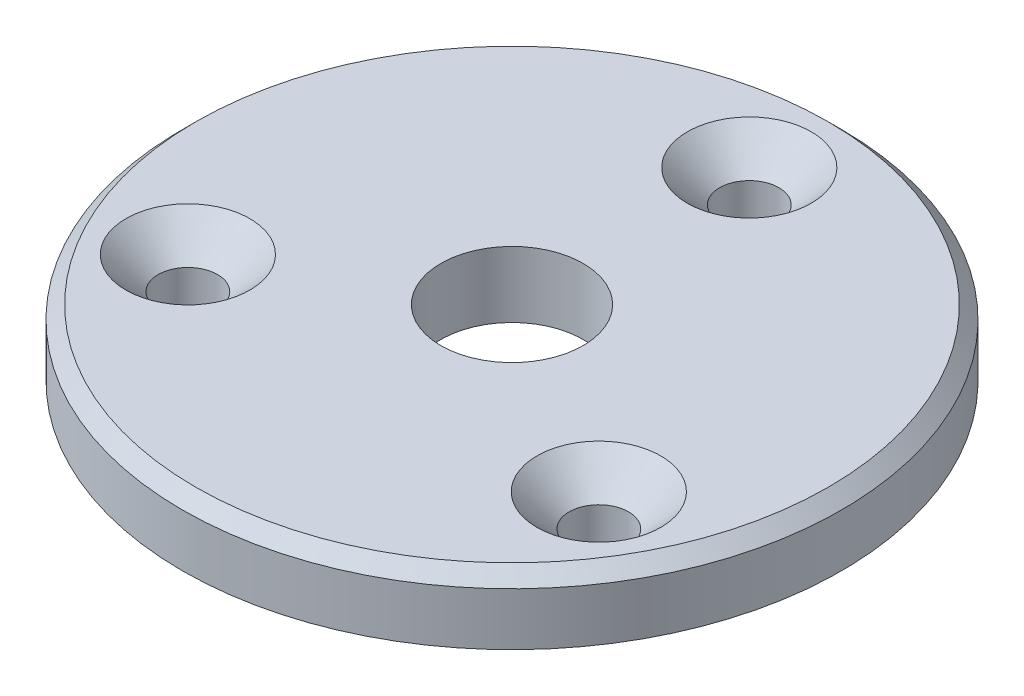
ISO-10303-21;
HEADER;
FILE_DESCRIPTION(('STEP AP214'),'2;1');
FILE_NAME('part.step','',(''),(''),'','','');
FILE_SCHEMA(('AUTOMOTIVE_DESIGN { 1 0 10303 214 1 1 1 1 }'));
ENDSEC;
DATA;
#1=APPLICATION_CONTEXT('core data for automotive mechanical design processes');
#2=APPLICATION_PROTOCOL_DEFINITION('international standard','automotive_design',2000,#1);
#3=PRODUCT_CONTEXT('',#1,'mechanical');
#4=PRODUCT('Part','Part','',(#3));
#5=PRODUCT_RELATED_PRODUCT_CATEGORY('part','',(#4));
#6=PRODUCT_DEFINITION_FORMATION('','',#4);
#7=PRODUCT_DEFINITION_CONTEXT('part definition',#1,'design');
#8=PRODUCT_DEFINITION('design','',#6,#7);
#9=PRODUCT_DEFINITION_SHAPE('','',#8);
#10=(LENGTH_UNIT() NAMED_UNIT(*) SI_UNIT(.MILLI.,.METRE.));
#11=(NAMED_UNIT(*) PLANE_ANGLE_UNIT() SI_UNIT($,.RADIAN.));
#12=(NAMED_UNIT(*) SI_UNIT($,.STERADIAN.) SOLID_ANGLE_UNIT());
#13=UNCERTAINTY_MEASURE_WITH_UNIT(LENGTH_MEASURE(1.E-05),#10,'distance_accuracy_value','');
#14=(GEOMETRIC_REPRESENTATION_CONTEXT(3) GLOBAL_UNCERTAINTY_ASSIGNED_CONTEXT((#13)) GLOBAL_UNIT_ASSIGNED_CONTEXT((#10,
#11,#12)) REPRESENTATION_CONTEXT('',''));
#15=CARTESIAN_POINT('',(0.,0.,0.));
#16=DIRECTION('',(0.,0.,1.));
#17=DIRECTION('',(1.,0.,0.));
#18=AXIS2_PLACEMENT_3D('',#15,#16,#17);
#19=CARTESIAN_POINT('',(0.,5.,0.));
#20=DIRECTION('',(0.,-1.,0.));
#21=DIRECTION('',(0.,0.,-1.));
#22=AXIS2_PLACEMENT_3D('',#19,#20,#21);
#23=CYLINDRICAL_SURFACE('',#22,25.);
#24=CARTESIAN_POINT('',(0.,4.,0.));
#25=DIRECTION('',(0.,1.,0.));
#26=DIRECTION('',(0.,0.,1.));
#27=AXIS2_PLACEMENT_3D('',#24,#25,#26);
#28=CIRCLE('',#27,25.);
#29=CARTESIAN_POINT('',(0.,4.,25.));
#30=VERTEX_POINT('',#29);
#31=EDGE_CURVE('E12',#30,#30,#28,.F.);
#32=ORIENTED_EDGE('',*,*,#31,.T.);
#33=EDGE_LOOP('',(#32));
#34=FACE_BOUND('',#33,.T.);
#35=CARTESIAN_POINT('',(0.,0.,0.));
#36=DIRECTION('',(0.,1.,0.));
#37=DIRECTION('',(0.,0.,1.));
#38=AXIS2_PLACEMENT_3D('',#35,#36,#37);
#39=CIRCLE('',#38,25.);
#40=CARTESIAN_POINT('',(0.,0.,25.));
#41=VERTEX_POINT('',#40);
#42=EDGE_CURVE('E62',#41,#41,#39,.T.);
#43=ORIENTED_EDGE('',*,*,#42,.T.);
#44=EDGE_LOOP('',(#43));
#45=FACE_BOUND('',#44,.T.);
#46=ADVANCED_FACE('F51',(#34,#45),#23,.T.);
#47=CARTESIAN_POINT('',(0.,5.,0.));
#48=DIRECTION('',(0.,1.,0.));
#49=DIRECTION('',(0.,0.,1.));
#50=AXIS2_PLACEMENT_3D('',#47,#48,#49);
#51=PLANE('',#50);
#52=CARTESIAN_POINT('',(-15.58845726812,5.,8.99999999999986));
#53=DIRECTION('',(0.,1.,0.));
#54=DIRECTION('',(0.,0.,1.));
#55=AXIS2_PLACEMENT_3D('',#52,#53,#54);
#56=CIRCLE('',#55,4.7);
#57=CARTESIAN_POINT('',(-15.58845726812,5.,13.6999999999999));
#58=VERTEX_POINT('',#57);
#59=EDGE_CURVE('E98',#58,#58,#56,.T.);
#60=ORIENTED_EDGE('',*,*,#59,.F.);
#61=EDGE_LOOP('',(#60));
#62=FACE_BOUND('',#61,.T.);
#63=CARTESIAN_POINT('',(15.5884572681199,5.,9.00000000000008));
#64=DIRECTION('',(0.,1.,0.));
#65=DIRECTION('',(0.,0.,1.));
#66=AXIS2_PLACEMENT_3D('',#63,#64,#65);
#67=CIRCLE('',#66,4.7);
#68=CARTESIAN_POINT('',(15.5884572681199,5.,13.7000000000001));
#69=VERTEX_POINT('',#68);
#70=EDGE_CURVE('E89',#69,#69,#67,.T.);
#71=ORIENTED_EDGE('',*,*,#70,.F.);
#72=EDGE_LOOP('',(#71));
#73=FACE_BOUND('',#72,.T.);
#74=CARTESIAN_POINT('',(0.,5.,0.));
#75=DIRECTION('',(0.,1.,0.));
#76=DIRECTION('',(0.,0.,1.));
#77=AXIS2_PLACEMENT_3D('',#74,#75,#76);
#78=CIRCLE('',#77,5.39999999999999);
#79=CARTESIAN_POINT('',(0.,5.,5.39999999999999));
#80=VERTEX_POINT('',#79);
#81=EDGE_CURVE('E80',#80,#80,#78,.T.);
#82=ORIENTED_EDGE('',*,*,#81,.F.);
#83=EDGE_LOOP('',(#82));
#84=FACE_BOUND('',#83,.T.);
#85=CARTESIAN_POINT('',(0.,5.,-18.));
#86=DIRECTION('',(0.,1.,0.));
#87=DIRECTION('',(0.,0.,1.));
#88=AXIS2_PLACEMENT_3D('',#85,#86,#87);
#89=CIRCLE('',#88,4.7);
#90=CARTESIAN_POINT('',(0.,5.,-13.3));
#91=VERTEX_POINT('',#90);
#92=EDGE_CURVE('E74',#91,#91,#89,.T.);
#93=ORIENTED_EDGE('',*,*,#92,.F.);
#94=EDGE_LOOP('',(#93));
#95=FACE_BOUND('',#94,.T.);
#96=CARTESIAN_POINT('',(0.,5.,0.));
#97=DIRECTION('',(0.,1.,0.));
#98=DIRECTION('',(0.,0.,1.));
#99=AXIS2_PLACEMENT_3D('',#96,#97,#98);
#100=CIRCLE('',#99,24.);
#101=CARTESIAN_POINT('',(0.,5.,24.));
#102=VERTEX_POINT('',#101);
#103=EDGE_CURVE('E58',#102,#102,#100,.T.);
#104=ORIENTED_EDGE('',*,*,#103,.T.);
#105=EDGE_LOOP('',(#104));
#106=FACE_BOUND('',#105,.T.);
#107=ADVANCED_FACE('F104',(#62,#73,#84,#95,#106),#51,.T.);
#108=CARTESIAN_POINT('',(0.,0.,0.));
#109=DIRECTION('',(0.,1.,0.));
#110=DIRECTION('',(0.,0.,1.));
#111=AXIS2_PLACEMENT_3D('',#108,#109,#110);
#112=PLANE('',#111);
#113=CARTESIAN_POINT('',(-15.58845726812,0.,8.99999999999986));
#114=DIRECTION('',(0.,1.,0.));
#115=DIRECTION('',(0.,0.,1.));
#116=AXIS2_PLACEMENT_3D('',#113,#114,#115);
#117=CIRCLE('',#116,2.25);
#118=CARTESIAN_POINT('',(-15.58845726812,0.,11.2499999999999));
#119=VERTEX_POINT('',#118);
#120=EDGE_CURVE('E92',#119,#119,#117,.T.);
#121=ORIENTED_EDGE('',*,*,#120,.T.);
#122=EDGE_LOOP('',(#121));
#123=FACE_BOUND('',#122,.T.);
#124=CARTESIAN_POINT('',(15.5884572681199,0.,9.00000000000008));
#125=DIRECTION('',(0.,1.,0.));
#126=DIRECTION('',(0.,0.,1.));
#127=AXIS2_PLACEMENT_3D('',#124,#125,#126);
#128=CIRCLE('',#127,2.25);
#129=CARTESIAN_POINT('',(15.5884572681199,0.,11.2500000000001));
#130=VERTEX_POINT('',#129);
#131=EDGE_CURVE('E83',#130,#130,#128,.T.);
#132=ORIENTED_EDGE('',*,*,#131,.T.);
#133=EDGE_LOOP('',(#132));
#134=FACE_BOUND('',#133,.T.);
#135=CARTESIAN_POINT('',(0.,0.,0.));
#136=DIRECTION('',(0.,1.,0.));
#137=DIRECTION('',(0.,0.,1.));
#138=AXIS2_PLACEMENT_3D('',#135,#136,#137);
#139=CIRCLE('',#138,5.4);
#140=CARTESIAN_POINT('',(0.,0.,5.4));
#141=VERTEX_POINT('',#140);
#142=EDGE_CURVE('E77',#141,#141,#139,.T.);
#143=ORIENTED_EDGE('',*,*,#142,.T.);
#144=EDGE_LOOP('',(#143));
#145=FACE_BOUND('',#144,.T.);
#146=CARTESIAN_POINT('',(0.,0.,-18.));
#147=DIRECTION('',(0.,1.,0.));
#148=DIRECTION('',(0.,0.,1.));
#149=AXIS2_PLACEMENT_3D('',#146,#147,#148);
#150=CIRCLE('',#149,2.25);
#151=CARTESIAN_POINT('',(0.,0.,-15.75));
#152=VERTEX_POINT('',#151);
#153=EDGE_CURVE('E66',#152,#152,#150,.T.);
#154=ORIENTED_EDGE('',*,*,#153,.T.);
#155=EDGE_LOOP('',(#154));
#156=FACE_BOUND('',#155,.T.);
#157=ORIENTED_EDGE('',*,*,#42,.F.);
#158=EDGE_LOOP('',(#157));
#159=FACE_BOUND('',#158,.T.);
#160=ADVANCED_FACE('F107',(#123,#134,#145,#156,#159),#112,.F.);
#161=CARTESIAN_POINT('',(0.,5.,0.));
#162=DIRECTION('',(0.,-1.,0.));
#163=DIRECTION('',(0.,0.,-1.));
#164=AXIS2_PLACEMENT_3D('',#161,#162,#163);
#165=CONICAL_SURFACE('',#164,24.,0.78539816339744);
#166=ORIENTED_EDGE('',*,*,#31,.F.);
#167=EDGE_LOOP('',(#166));
#168=FACE_BOUND('',#167,.T.);
#169=ORIENTED_EDGE('',*,*,#103,.F.);
#170=EDGE_LOOP('',(#169));
#171=FACE_BOUND('',#170,.T.);
#172=ADVANCED_FACE('F53',(#168,#171),#165,.T.);
#173=CARTESIAN_POINT('',(0.,5.,-18.));
#174=DIRECTION('',(0.,1.,0.));
#175=DIRECTION('',(0.,0.,1.));
#176=AXIS2_PLACEMENT_3D('',#173,#174,#175);
#177=CYLINDRICAL_SURFACE('',#176,2.25);
#178=ORIENTED_EDGE('',*,*,#153,.F.);
#179=EDGE_LOOP('',(#178));
#180=FACE_BOUND('',#179,.T.);
#181=CARTESIAN_POINT('',(0.,2.55,-18.));
#182=DIRECTION('',(0.,1.,0.));
#183=DIRECTION('',(0.,0.,1.));
#184=AXIS2_PLACEMENT_3D('',#181,#182,#183);
#185=CIRCLE('',#184,2.25);
#186=CARTESIAN_POINT('',(0.,2.55,-15.75));
#187=VERTEX_POINT('',#186);
#188=EDGE_CURVE('E71',#187,#187,#185,.T.);
#189=ORIENTED_EDGE('',*,*,#188,.T.);
#190=EDGE_LOOP('',(#189));
#191=FACE_BOUND('',#190,.T.);
#192=ADVANCED_FACE('F118',(#180,#191),#177,.F.);
#193=CARTESIAN_POINT('',(0.,5.,-18.));
#194=DIRECTION('',(0.,1.,0.));
#195=DIRECTION('',(0.,0.,1.));
#196=AXIS2_PLACEMENT_3D('',#193,#194,#195);
#197=CONICAL_SURFACE('',#196,4.7,0.785398163397448);
#198=ORIENTED_EDGE('',*,*,#188,.F.);
#199=EDGE_LOOP('',(#198));
#200=FACE_BOUND('',#199,.T.);
#201=ORIENTED_EDGE('',*,*,#92,.T.);
#202=EDGE_LOOP('',(#201));
#203=FACE_BOUND('',#202,.T.);
#204=ADVANCED_FACE('F115',(#200,#203),#197,.F.);
#205=CARTESIAN_POINT('',(0.,5.,0.));
#206=DIRECTION('',(0.,1.,0.));
#207=DIRECTION('',(0.,0.,1.));
#208=AXIS2_PLACEMENT_3D('',#205,#206,#207);
#209=CYLINDRICAL_SURFACE('',#208,5.39999999999999);
#210=ORIENTED_EDGE('',*,*,#142,.F.);
#211=EDGE_LOOP('',(#210));
#212=FACE_BOUND('',#211,.T.);
#213=ORIENTED_EDGE('',*,*,#81,.T.);
#214=EDGE_LOOP('',(#213));
#215=FACE_BOUND('',#214,.T.);
#216=ADVANCED_FACE('F117',(#212,#215),#209,.F.);
#217=CARTESIAN_POINT('',(15.5884572681199,5.,9.00000000000008));
#218=DIRECTION('',(0.,1.,0.));
#219=DIRECTION('',(0.,0.,1.));
#220=AXIS2_PLACEMENT_3D('',#217,#218,#219);
#221=CYLINDRICAL_SURFACE('',#220,2.25);
#222=ORIENTED_EDGE('',*,*,#131,.F.);
#223=EDGE_LOOP('',(#222));
#224=FACE_BOUND('',#223,.T.);
#225=CARTESIAN_POINT('',(15.5884572681199,2.55,9.00000000000008));
#226=DIRECTION('',(0.,1.,0.));
#227=DIRECTION('',(0.,0.,1.));
#228=AXIS2_PLACEMENT_3D('',#225,#226,#227);
#229=CIRCLE('',#228,2.25);
#230=CARTESIAN_POINT('',(15.5884572681199,2.55,11.2500000000001));
#231=VERTEX_POINT('',#230);
#232=EDGE_CURVE('E86',#231,#231,#229,.T.);
#233=ORIENTED_EDGE('',*,*,#232,.T.);
#234=EDGE_LOOP('',(#233));
#235=FACE_BOUND('',#234,.T.);
#236=ADVANCED_FACE('F125',(#224,#235),#221,.F.);
#237=CARTESIAN_POINT('',(15.5884572681199,5.,9.00000000000008));
#238=DIRECTION('',(0.,1.,0.));
#239=DIRECTION('',(0.,0.,1.));
#240=AXIS2_PLACEMENT_3D('',#237,#238,#239);
#241=CONICAL_SURFACE('',#240,4.7,0.785398163397449);
#242=ORIENTED_EDGE('',*,*,#232,.F.);
#243=EDGE_LOOP('',(#242));
#244=FACE_BOUND('',#243,.T.);
#245=ORIENTED_EDGE('',*,*,#70,.T.);
#246=EDGE_LOOP('',(#245));
#247=FACE_BOUND('',#246,.T.);
#248=ADVANCED_FACE('F156',(#244,#247),#241,.F.);
#249=CARTESIAN_POINT('',(-15.58845726812,5.,8.99999999999986));
#250=DIRECTION('',(0.,1.,0.));
#251=DIRECTION('',(0.,0.,1.));
#252=AXIS2_PLACEMENT_3D('',#249,#250,#251);
#253=CYLINDRICAL_SURFACE('',#252,2.25);
#254=ORIENTED_EDGE('',*,*,#120,.F.);
#255=EDGE_LOOP('',(#254));
#256=FACE_BOUND('',#255,.T.);
#257=CARTESIAN_POINT('',(-15.58845726812,2.55,8.99999999999986));
#258=DIRECTION('',(0.,1.,0.));
#259=DIRECTION('',(0.,0.,1.));
#260=AXIS2_PLACEMENT_3D('',#257,#258,#259);
#261=CIRCLE('',#260,2.25);
#262=CARTESIAN_POINT('',(-15.58845726812,2.55,11.2499999999999));
#263=VERTEX_POINT('',#262);
#264=EDGE_CURVE('E95',#263,#263,#261,.T.);
#265=ORIENTED_EDGE('',*,*,#264,.T.);
#266=EDGE_LOOP('',(#265));
#267=FACE_BOUND('',#266,.T.);
#268=ADVANCED_FACE('F162',(#256,#267),#253,.F.);
#269=CARTESIAN_POINT('',(-15.58845726812,5.,8.99999999999986));
#270=DIRECTION('',(0.,1.,0.));
#271=DIRECTION('',(0.,0.,1.));
#272=AXIS2_PLACEMENT_3D('',#269,#270,#271);
#273=CONICAL_SURFACE('',#272,4.7,0.785398163397449);
#274=ORIENTED_EDGE('',*,*,#264,.F.);
#275=EDGE_LOOP('',(#274));
#276=FACE_BOUND('',#275,.T.);
#277=ORIENTED_EDGE('',*,*,#59,.T.);
#278=EDGE_LOOP('',(#277));
#279=FACE_BOUND('',#278,.T.);
#280=ADVANCED_FACE('F102',(#276,#279),#273,.F.);
#281=CLOSED_SHELL('',(#46,#107,#160,#172,#192,#204,#216,#236,#248,#268,#280));
#282=MANIFOLD_SOLID_BREP('B2',#281);
#283=ADVANCED_BREP_SHAPE_REPRESENTATION('',(#18,#282),#14);
#284=SHAPE_DEFINITION_REPRESENTATION(#9,#283);
ENDSEC;
END-ISO-10303-21;
